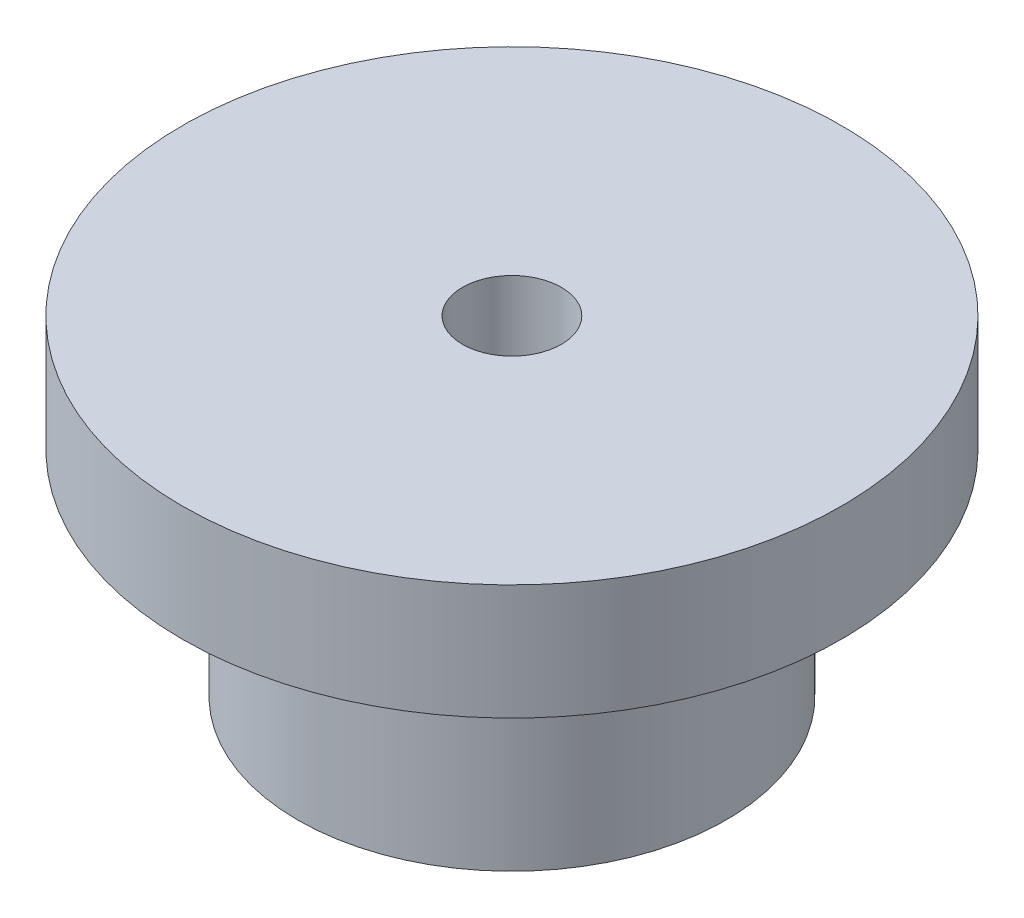
ISO-10303-21;
HEADER;
FILE_DESCRIPTION(('STEP AP214'),'2;1');
FILE_NAME('part.step','',(''),(''),'','','');
FILE_SCHEMA(('AUTOMOTIVE_DESIGN { 1 0 10303 214 1 1 1 1 }'));
ENDSEC;
DATA;
#1=APPLICATION_CONTEXT('core data for automotive mechanical design processes');
#2=APPLICATION_PROTOCOL_DEFINITION('international standard','automotive_design',2000,#1);
#3=PRODUCT_CONTEXT('',#1,'mechanical');
#4=PRODUCT('Part','Part','',(#3));
#5=PRODUCT_RELATED_PRODUCT_CATEGORY('part','',(#4));
#6=PRODUCT_DEFINITION_FORMATION('','',#4);
#7=PRODUCT_DEFINITION_CONTEXT('part definition',#1,'design');
#8=PRODUCT_DEFINITION('design','',#6,#7);
#9=PRODUCT_DEFINITION_SHAPE('','',#8);
#10=(LENGTH_UNIT() NAMED_UNIT(*) SI_UNIT(.MILLI.,.METRE.));
#11=(NAMED_UNIT(*) PLANE_ANGLE_UNIT() SI_UNIT($,.RADIAN.));
#12=(NAMED_UNIT(*) SI_UNIT($,.STERADIAN.) SOLID_ANGLE_UNIT());
#13=UNCERTAINTY_MEASURE_WITH_UNIT(LENGTH_MEASURE(1.E-05),#10,'distance_accuracy_value','');
#14=(GEOMETRIC_REPRESENTATION_CONTEXT(3) GLOBAL_UNCERTAINTY_ASSIGNED_CONTEXT((#13)) GLOBAL_UNIT_ASSIGNED_CONTEXT((#10,
#11,#12)) REPRESENTATION_CONTEXT('',''));
#15=CARTESIAN_POINT('',(0.,0.,0.));
#16=DIRECTION('',(0.,0.,1.));
#17=DIRECTION('',(1.,0.,0.));
#18=AXIS2_PLACEMENT_3D('',#15,#16,#17);
#19=CARTESIAN_POINT('',(0.,20.,0.));
#20=DIRECTION('',(0.,-1.,0.));
#21=DIRECTION('',(0.,0.,-1.));
#22=AXIS2_PLACEMENT_3D('',#19,#20,#21);
#23=CYLINDRICAL_SURFACE('',#22,13.);
#24=CARTESIAN_POINT('',(0.,0.,0.));
#25=DIRECTION('',(0.,1.,0.));
#26=DIRECTION('',(0.,0.,1.));
#27=AXIS2_PLACEMENT_3D('',#24,#25,#26);
#28=CIRCLE('',#27,13.);
#29=CARTESIAN_POINT('',(0.,0.,13.));
#30=VERTEX_POINT('',#29);
#31=EDGE_CURVE('E40',#30,#30,#28,.T.);
#32=ORIENTED_EDGE('',*,*,#31,.T.);
#33=EDGE_LOOP('',(#32));
#34=FACE_BOUND('',#33,.T.);
#35=CARTESIAN_POINT('',(0.,13.,0.));
#36=DIRECTION('',(0.,1.,0.));
#37=DIRECTION('',(0.,0.,1.));
#38=AXIS2_PLACEMENT_3D('',#35,#36,#37);
#39=CIRCLE('',#38,13.);
#40=CARTESIAN_POINT('',(0.,13.,13.));
#41=VERTEX_POINT('',#40);
#42=EDGE_CURVE('E10',#41,#41,#39,.T.);
#43=ORIENTED_EDGE('',*,*,#42,.F.);
#44=EDGE_LOOP('',(#43));
#45=FACE_BOUND('',#44,.T.);
#46=ADVANCED_FACE('F29',(#34,#45),#23,.T.);
#47=CARTESIAN_POINT('',(0.,5.,0.));
#48=DIRECTION('',(0.,-1.,0.));
#49=DIRECTION('',(0.,0.,-1.));
#50=AXIS2_PLACEMENT_3D('',#47,#48,#49);
#51=CONICAL_SURFACE('',#50,5.,0.122173047639603);
#52=CARTESIAN_POINT('',(0.,5.,0.));
#53=DIRECTION('',(0.,-1.,0.));
#54=DIRECTION('',(0.,0.,-1.));
#55=AXIS2_PLACEMENT_3D('',#52,#53,#54);
#56=CIRCLE('',#55,5.);
#57=CARTESIAN_POINT('',(0.,5.,-5.));
#58=VERTEX_POINT('',#57);
#59=EDGE_CURVE('E45',#58,#58,#56,.T.);
#60=ORIENTED_EDGE('',*,*,#59,.T.);
#61=EDGE_LOOP('',(#60));
#62=FACE_BOUND('',#61,.T.);
#63=CARTESIAN_POINT('',(0.,13.,0.));
#64=DIRECTION('',(0.,1.,0.));
#65=DIRECTION('',(0.,0.,1.));
#66=AXIS2_PLACEMENT_3D('',#63,#64,#65);
#67=CIRCLE('',#66,4.01772351277676);
#68=CARTESIAN_POINT('',(0.,13.,4.01772351277676));
#69=VERTEX_POINT('',#68);
#70=EDGE_CURVE('E32',#69,#69,#67,.F.);
#71=ORIENTED_EDGE('',*,*,#70,.F.);
#72=EDGE_LOOP('',(#71));
#73=FACE_BOUND('',#72,.T.);
#74=ADVANCED_FACE('F62',(#62,#73),#51,.F.);
#75=CARTESIAN_POINT('',(0.,0.,0.));
#76=DIRECTION('',(0.,1.,0.));
#77=DIRECTION('',(0.,0.,1.));
#78=AXIS2_PLACEMENT_3D('',#75,#76,#77);
#79=PLANE('',#78);
#80=CARTESIAN_POINT('',(0.,0.,0.));
#81=DIRECTION('',(0.,-1.,0.));
#82=DIRECTION('',(0.,0.,-1.));
#83=AXIS2_PLACEMENT_3D('',#80,#81,#82);
#84=CIRCLE('',#83,5.5);
#85=CARTESIAN_POINT('',(0.,0.,-5.5));
#86=VERTEX_POINT('',#85);
#87=EDGE_CURVE('E48',#86,#86,#84,.T.);
#88=ORIENTED_EDGE('',*,*,#87,.F.);
#89=EDGE_LOOP('',(#88));
#90=FACE_BOUND('',#89,.T.);
#91=ORIENTED_EDGE('',*,*,#31,.F.);
#92=EDGE_LOOP('',(#91));
#93=FACE_BOUND('',#92,.T.);
#94=ADVANCED_FACE('F59',(#90,#93),#79,.F.);
#95=CARTESIAN_POINT('',(0.,5.,0.));
#96=DIRECTION('',(0.,-1.,0.));
#97=DIRECTION('',(0.,0.,-1.));
#98=AXIS2_PLACEMENT_3D('',#95,#96,#97);
#99=CYLINDRICAL_SURFACE('',#98,5.5);
#100=CARTESIAN_POINT('',(0.,5.,0.));
#101=DIRECTION('',(0.,-1.,0.));
#102=DIRECTION('',(0.,0.,-1.));
#103=AXIS2_PLACEMENT_3D('',#100,#101,#102);
#104=CIRCLE('',#103,5.5);
#105=CARTESIAN_POINT('',(0.,5.,-5.5));
#106=VERTEX_POINT('',#105);
#107=EDGE_CURVE('E50',#106,#106,#104,.T.);
#108=ORIENTED_EDGE('',*,*,#107,.F.);
#109=EDGE_LOOP('',(#108));
#110=FACE_BOUND('',#109,.T.);
#111=ORIENTED_EDGE('',*,*,#87,.T.);
#112=EDGE_LOOP('',(#111));
#113=FACE_BOUND('',#112,.T.);
#114=ADVANCED_FACE('F61',(#110,#113),#99,.F.);
#115=CARTESIAN_POINT('',(0.,5.,0.));
#116=DIRECTION('',(0.,-1.,0.));
#117=DIRECTION('',(0.,0.,-1.));
#118=AXIS2_PLACEMENT_3D('',#115,#116,#117);
#119=PLANE('',#118);
#120=ORIENTED_EDGE('',*,*,#59,.F.);
#121=EDGE_LOOP('',(#120));
#122=FACE_BOUND('',#121,.T.);
#123=ORIENTED_EDGE('',*,*,#107,.T.);
#124=EDGE_LOOP('',(#123));
#125=FACE_BOUND('',#124,.T.);
#126=ADVANCED_FACE('F68',(#122,#125),#119,.T.);
#127=CARTESIAN_POINT('',(0.,13.,0.));
#128=DIRECTION('',(0.,1.,0.));
#129=DIRECTION('',(0.,0.,1.));
#130=AXIS2_PLACEMENT_3D('',#127,#128,#129);
#131=PLANE('',#130);
#132=CARTESIAN_POINT('',(0.,13.,0.));
#133=DIRECTION('',(0.,1.,0.));
#134=DIRECTION('',(0.,0.,1.));
#135=AXIS2_PLACEMENT_3D('',#132,#133,#134);
#136=CIRCLE('',#135,3.);
#137=CARTESIAN_POINT('',(0.,13.,3.));
#138=VERTEX_POINT('',#137);
#139=EDGE_CURVE('E169',#138,#138,#136,.T.);
#140=ORIENTED_EDGE('',*,*,#139,.T.);
#141=EDGE_LOOP('',(#140));
#142=FACE_BOUND('',#141,.T.);
#143=ORIENTED_EDGE('',*,*,#70,.T.);
#144=EDGE_LOOP('',(#143));
#145=FACE_BOUND('',#144,.T.);
#146=ADVANCED_FACE('F95',(#142,#145),#131,.F.);
#147=CARTESIAN_POINT('',(0.,13.,0.));
#148=DIRECTION('',(0.,1.,0.));
#149=DIRECTION('',(0.,0.,1.));
#150=AXIS2_PLACEMENT_3D('',#147,#148,#149);
#151=CIRCLE('',#150,20.);
#152=CARTESIAN_POINT('',(0.,13.,20.));
#153=VERTEX_POINT('',#152);
#154=EDGE_CURVE('E49',#153,#153,#151,.T.);
#155=ORIENTED_EDGE('',*,*,#154,.F.);
#156=EDGE_LOOP('',(#155));
#157=FACE_BOUND('',#156,.T.);
#158=ORIENTED_EDGE('',*,*,#42,.T.);
#159=EDGE_LOOP('',(#158));
#160=FACE_BOUND('',#159,.T.);
#161=ADVANCED_FACE('F89',(#157,#160),#131,.F.);
#162=CARTESIAN_POINT('',(0.,13.,0.));
#163=DIRECTION('',(0.,1.,0.));
#164=DIRECTION('',(0.,0.,1.));
#165=AXIS2_PLACEMENT_3D('',#162,#163,#164);
#166=CYLINDRICAL_SURFACE('',#165,20.);
#167=ORIENTED_EDGE('',*,*,#154,.T.);
#168=EDGE_LOOP('',(#167));
#169=FACE_BOUND('',#168,.T.);
#170=CARTESIAN_POINT('',(0.,20.,0.));
#171=DIRECTION('',(0.,1.,0.));
#172=DIRECTION('',(0.,0.,1.));
#173=AXIS2_PLACEMENT_3D('',#170,#171,#172);
#174=CIRCLE('',#173,20.);
#175=CARTESIAN_POINT('',(0.,20.,20.));
#176=VERTEX_POINT('',#175);
#177=EDGE_CURVE('E43',#176,#176,#174,.T.);
#178=ORIENTED_EDGE('',*,*,#177,.F.);
#179=EDGE_LOOP('',(#178));
#180=FACE_BOUND('',#179,.T.);
#181=ADVANCED_FACE('F94',(#169,#180),#166,.T.);
#182=CARTESIAN_POINT('',(0.,20.,0.));
#183=DIRECTION('',(0.,1.,0.));
#184=DIRECTION('',(0.,0.,1.));
#185=AXIS2_PLACEMENT_3D('',#182,#183,#184);
#186=PLANE('',#185);
#187=CARTESIAN_POINT('',(0.,20.,0.));
#188=DIRECTION('',(0.,1.,0.));
#189=DIRECTION('',(0.,0.,1.));
#190=AXIS2_PLACEMENT_3D('',#187,#188,#189);
#191=CIRCLE('',#190,3.);
#192=CARTESIAN_POINT('',(0.,20.,3.));
#193=VERTEX_POINT('',#192);
#194=EDGE_CURVE('E166',#193,#193,#191,.T.);
#195=ORIENTED_EDGE('',*,*,#194,.F.);
#196=EDGE_LOOP('',(#195));
#197=FACE_BOUND('',#196,.T.);
#198=ORIENTED_EDGE('',*,*,#177,.T.);
#199=EDGE_LOOP('',(#198));
#200=FACE_BOUND('',#199,.T.);
#201=ADVANCED_FACE('F107',(#197,#200),#186,.T.);
#202=CARTESIAN_POINT('',(0.,0.,0.));
#203=DIRECTION('',(0.,1.,0.));
#204=DIRECTION('',(0.,0.,1.));
#205=AXIS2_PLACEMENT_3D('',#202,#203,#204);
#206=CYLINDRICAL_SURFACE('',#205,3.);
#207=ORIENTED_EDGE('',*,*,#194,.T.);
#208=EDGE_LOOP('',(#207));
#209=FACE_BOUND('',#208,.T.);
#210=ORIENTED_EDGE('',*,*,#139,.F.);
#211=EDGE_LOOP('',(#210));
#212=FACE_BOUND('',#211,.T.);
#213=ADVANCED_FACE('F124',(#209,#212),#206,.F.);
#214=CLOSED_SHELL('',(#46,#74,#94,#114,#126,#146,#161,#181,#201,#213));
#215=MANIFOLD_SOLID_BREP('B2',#214);
#216=ADVANCED_BREP_SHAPE_REPRESENTATION('',(#18,#215),#14);
#217=SHAPE_DEFINITION_REPRESENTATION(#9,#216);
ENDSEC;
END-ISO-10303-21;
